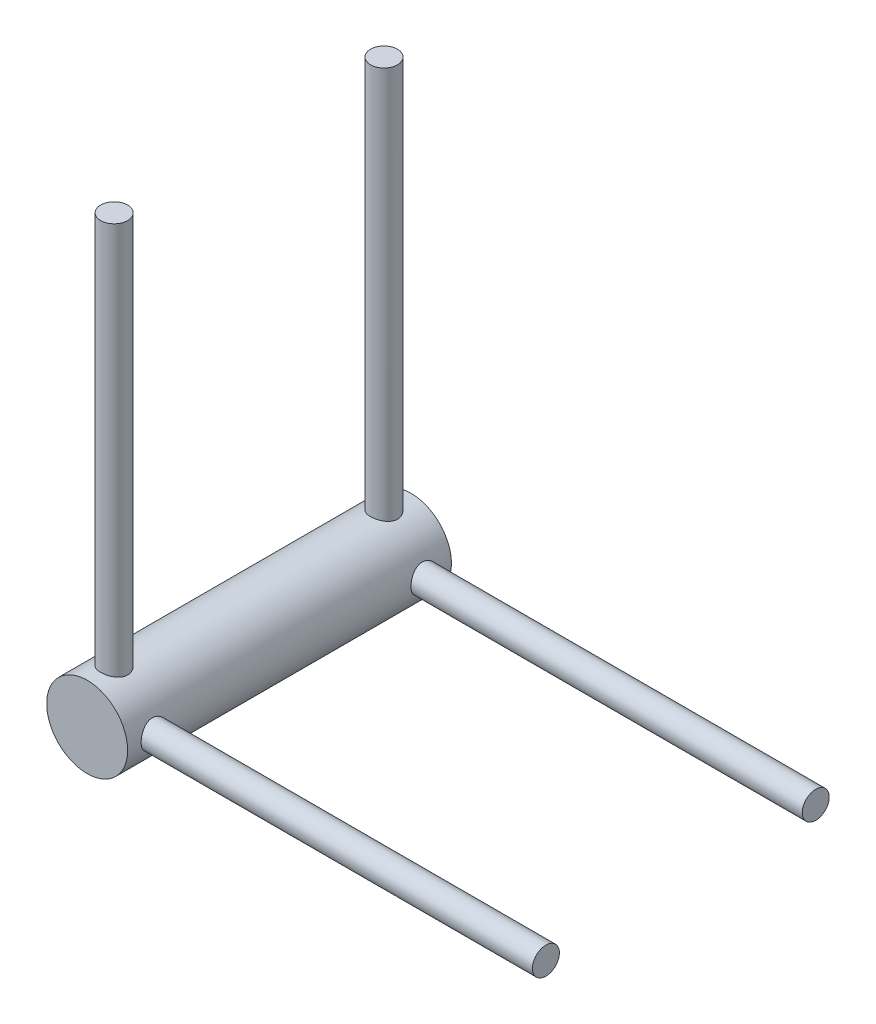
ISO-10303-21;
HEADER;
FILE_DESCRIPTION(('STEP AP214'),'2;1');
FILE_NAME('part.step','',(''),(''),'','','');
FILE_SCHEMA(('AUTOMOTIVE_DESIGN { 1 0 10303 214 1 1 1 1 }'));
ENDSEC;
DATA;
#1=APPLICATION_CONTEXT('core data for automotive mechanical design processes');
#2=APPLICATION_PROTOCOL_DEFINITION('international standard','automotive_design',2000,#1);
#3=PRODUCT_CONTEXT('',#1,'mechanical');
#4=PRODUCT('Part','Part','',(#3));
#5=PRODUCT_RELATED_PRODUCT_CATEGORY('part','',(#4));
#6=PRODUCT_DEFINITION_FORMATION('','',#4);
#7=PRODUCT_DEFINITION_CONTEXT('part definition',#1,'design');
#8=PRODUCT_DEFINITION('design','',#6,#7);
#9=PRODUCT_DEFINITION_SHAPE('','',#8);
#10=(LENGTH_UNIT() NAMED_UNIT(*) SI_UNIT(.MILLI.,.METRE.));
#11=(NAMED_UNIT(*) PLANE_ANGLE_UNIT() SI_UNIT($,.RADIAN.));
#12=(NAMED_UNIT(*) SI_UNIT($,.STERADIAN.) SOLID_ANGLE_UNIT());
#13=UNCERTAINTY_MEASURE_WITH_UNIT(LENGTH_MEASURE(1.E-05),#10,'distance_accuracy_value','');
#14=(GEOMETRIC_REPRESENTATION_CONTEXT(3) GLOBAL_UNCERTAINTY_ASSIGNED_CONTEXT((#13)) GLOBAL_UNIT_ASSIGNED_CONTEXT((#10,
#11,#12)) REPRESENTATION_CONTEXT('',''));
#15=CARTESIAN_POINT('',(0.,0.,0.));
#16=DIRECTION('',(0.,0.,1.));
#17=DIRECTION('',(1.,0.,0.));
#18=AXIS2_PLACEMENT_3D('',#15,#16,#17);
#19=CARTESIAN_POINT('',(0.,0.,38.1));
#20=DIRECTION('',(0.,0.,-1.));
#21=DIRECTION('',(-1.,0.,0.));
#22=AXIS2_PLACEMENT_3D('',#19,#20,#21);
#23=CYLINDRICAL_SURFACE('',#22,9.525);
#24=CARTESIAN_POINT('',(0.,0.,38.1));
#25=DIRECTION('',(0.,0.,1.));
#26=DIRECTION('',(1.,0.,0.));
#27=AXIS2_PLACEMENT_3D('',#24,#25,#26);
#28=CIRCLE('',#27,9.525);
#29=CARTESIAN_POINT('',(9.525,0.,38.1));
#30=VERTEX_POINT('',#29);
#31=EDGE_CURVE('E89',#30,#30,#28,.T.);
#32=ORIENTED_EDGE('',*,*,#31,.F.);
#33=EDGE_LOOP('',(#32));
#34=FACE_BOUND('',#33,.T.);
#35=CARTESIAN_POINT('',(0.,0.,-38.1));
#36=DIRECTION('',(0.,0.,1.));
#37=DIRECTION('',(1.,0.,0.));
#38=AXIS2_PLACEMENT_3D('',#35,#36,#37);
#39=CIRCLE('',#38,9.525);
#40=CARTESIAN_POINT('',(9.525,0.,-38.1));
#41=VERTEX_POINT('',#40);
#42=EDGE_CURVE('E90',#41,#41,#39,.T.);
#43=ORIENTED_EDGE('',*,*,#42,.T.);
#44=EDGE_LOOP('',(#43));
#45=FACE_BOUND('',#44,.T.);
#46=CARTESIAN_POINT('',(9.52499999999997,0.,34.925));
#47=CARTESIAN_POINT('',(9.52500048580495,-0.173238677165347,34.925000805598));
#48=CARTESIAN_POINT('',(9.52023018186454,-0.346472492659897,34.9107751550461));
#49=CARTESIAN_POINT('',(9.50167042395417,-0.687837590771688,34.8544225795053));
#50=CARTESIAN_POINT('',(9.48788003366835,-0.855968341777248,34.8122927579622));
#51=CARTESIAN_POINT('',(9.45277852602955,-1.18215660666814,34.7017364022556));
#52=CARTESIAN_POINT('',(9.43147998545459,-1.34023044718816,34.6333538266918));
#53=CARTESIAN_POINT('',(9.3835361515256,-1.64266542435691,34.4724317762382));
#54=CARTESIAN_POINT('',(9.35688980370195,-1.78702384834389,34.3798875361167));
#55=CARTESIAN_POINT('',(9.30002249856541,-2.0629298181957,34.1699030695735));
#56=CARTESIAN_POINT('',(9.26971591772517,-2.19393674844714,34.0517758312229));
#57=CARTESIAN_POINT('',(9.2094149943641,-2.43469379932912,33.7954392838067));
#58=CARTESIAN_POINT('',(9.17942072197493,-2.54443923892904,33.657225564102));
#59=CARTESIAN_POINT('',(9.12219830615344,-2.74264419157345,33.3597722592512));
#60=CARTESIAN_POINT('',(9.0950744970031,-2.83040092485178,33.2000423763505));
#61=CARTESIAN_POINT('',(9.04796594704058,-2.97757492456177,32.8670409000941));
#62=CARTESIAN_POINT('',(9.02797902810367,-3.03700083920298,32.6937734580083));
#63=CARTESIAN_POINT('',(8.99830887880273,-3.1237982402916,32.3447625217479));
#64=CARTESIAN_POINT('',(8.98830104068516,-3.15218269826287,32.1692993630472));
#65=CARTESIAN_POINT('',(8.97876209798686,-3.17925806658697,31.8158375805551));
#66=CARTESIAN_POINT('',(8.97922775597168,-3.17795815259498,31.6378397572483));
#67=CARTESIAN_POINT('',(8.99029872650972,-3.14648819425836,31.2930011983402));
#68=CARTESIAN_POINT('',(9.00043970379417,-3.11764017430521,31.1260223207321));
#69=CARTESIAN_POINT('',(9.02895888275449,-3.0340495670469,30.7994258927483));
#70=CARTESIAN_POINT('',(9.04733807064542,-2.97930387942919,30.6398092262436));
#71=CARTESIAN_POINT('',(9.09059367841715,-2.84460650934117,30.3294645200471));
#72=CARTESIAN_POINT('',(9.11556996393148,-2.76426310464556,30.1789210191343));
#73=CARTESIAN_POINT('',(9.16916373477931,-2.58092291251247,29.8930348662119));
#74=CARTESIAN_POINT('',(9.19778227084722,-2.47791958175572,29.7576966219865));
#75=CARTESIAN_POINT('',(9.25726270107577,-2.2458341312661,29.4986341758395));
#76=CARTESIAN_POINT('',(9.28816371201626,-2.11567125149229,29.3758851949337));
#77=CARTESIAN_POINT('',(9.34742029378842,-1.83622813465495,29.1537032283437));
#78=CARTESIAN_POINT('',(9.37577562033364,-1.68694606622308,29.0542724788277));
#79=CARTESIAN_POINT('',(9.42711817702495,-1.3714336714219,28.8807642467537));
#80=CARTESIAN_POINT('',(9.45004936275525,-1.20504990262187,28.8069480649932));
#81=CARTESIAN_POINT('',(9.4875530068358,-0.861279339682309,28.6886549226906));
#82=CARTESIAN_POINT('',(9.50212836854242,-0.683896391141976,28.6441677705306));
#83=CARTESIAN_POINT('',(9.52079715951823,-0.331418658755538,28.587523260379));
#84=CARTESIAN_POINT('',(9.52531755822087,-0.156557979570884,28.5740481058765));
#85=CARTESIAN_POINT('',(9.52464766056077,0.192960847123757,28.5760562386751));
#86=CARTESIAN_POINT('',(9.51945900331475,0.367619023839893,28.5915346379361));
#87=CARTESIAN_POINT('',(9.50023578476806,0.706500575516015,28.6499678070617));
#88=CARTESIAN_POINT('',(9.48646180908036,0.870879661700632,28.6921137042071));
#89=CARTESIAN_POINT('',(9.45171613685472,1.19016766849015,28.8016741861819));
#90=CARTESIAN_POINT('',(9.43074352248193,1.34507537851483,28.8690919933102));
#91=CARTESIAN_POINT('',(9.38304356837145,1.64556534104865,29.0292486210945));
#92=CARTESIAN_POINT('',(9.35617936849621,1.79079512051445,29.1226068336741));
#93=CARTESIAN_POINT('',(9.29974181184133,2.06395583568049,29.3312664262928));
#94=CARTESIAN_POINT('',(9.27016762910402,2.19188146775096,29.4465745079009));
#95=CARTESIAN_POINT('',(9.20993992337912,2.432851712285,29.7020575344459));
#96=CARTESIAN_POINT('',(9.17929841452584,2.54495607735532,29.8431242954928));
#97=CARTESIAN_POINT('',(9.121774152107,2.74401763337735,30.1427247277996));
#98=CARTESIAN_POINT('',(9.09489142987857,2.83097461468097,30.3012585446632));
#99=CARTESIAN_POINT('',(9.04819093937643,2.97687025407195,30.6313618235454));
#100=CARTESIAN_POINT('',(9.02835890517707,3.03586556962394,30.8029041013608));
#101=CARTESIAN_POINT('',(8.99829392572977,3.12386556696095,31.1543022138901));
#102=CARTESIAN_POINT('',(8.98805665630055,3.15288375947876,31.3341542651588));
#103=CARTESIAN_POINT('',(8.97883201925513,3.17905219686556,31.6871257799299));
#104=CARTESIAN_POINT('',(8.97929370817293,3.17776306695417,31.8601164304107));
#105=CARTESIAN_POINT('',(8.99005281690779,3.1471942816996,32.2032791128776));
#106=CARTESIAN_POINT('',(9.00034965132723,3.11791629228101,32.3734513120074));
#107=CARTESIAN_POINT('',(9.02920864668031,3.03330550668567,32.7029307300329));
#108=CARTESIAN_POINT('',(9.04761011221366,2.97847812359925,32.8623829193893));
#109=CARTESIAN_POINT('',(9.09054566248638,2.84473448628719,33.169947017029));
#110=CARTESIAN_POINT('',(9.11508110823773,2.76581288515833,33.3180563990219));
#111=CARTESIAN_POINT('',(9.16885482792697,2.58210269895239,33.6057356520052));
#112=CARTESIAN_POINT('',(9.19825159463785,2.47633567077754,33.7446508935274));
#113=CARTESIAN_POINT('',(9.25777156199328,2.24359115395568,34.0032651574948));
#114=CARTESIAN_POINT('',(9.28789496596782,2.11660766813345,34.1229587278096));
#115=CARTESIAN_POINT('',(9.34688346918603,1.83909194322318,34.3444335090181));
#116=CARTESIAN_POINT('',(9.3756537721899,1.68783480536163,34.4453348041094));
#117=CARTESIAN_POINT('',(9.42740021973043,1.36955960976603,34.6201696116008));
#118=CARTESIAN_POINT('',(9.45037784507677,1.2025455950702,34.6941100183025));
#119=CARTESIAN_POINT('',(9.48707510342621,0.865167329863097,34.8098161831515));
#120=CARTESIAN_POINT('',(9.5011624944151,0.695286130622597,34.8528718303862));
#121=CARTESIAN_POINT('',(9.52012342428903,0.350267320832535,34.9104593911499));
#122=CARTESIAN_POINT('',(9.52499950888796,0.17513117618077,34.9249991856015));
#123=CARTESIAN_POINT('',(9.52499999999997,0.,34.925));
#124=B_SPLINE_CURVE_WITH_KNOTS('',3,(#46,#47,#48,#49,#50,#51,#52,#53,#54,#55,#56,#57,#58,#59,
#60,#61,#62,#63,#64,#65,#66,#67,#68,#69,#70,#71,#72,#73,#74,#75,#76,#77,#78,#79,#80,#81,#82,#83,
#84,#85,#86,#87,#88,#89,#90,#91,#92,#93,#94,#95,#96,#97,#98,#99,#100,#101,#102,#103,#104,#105,
#106,#107,#108,#109,#110,#111,#112,#113,#114,#115,#116,#117,#118,#119,#120,#121,#122,#123),
.UNSPECIFIED.,.T.,.F.,(4,2,2,2,2,2,2,2,2,2,2,2,2,2,2,2,2,2,2,2,2,2,2,2,2,2,2,2,2,2,2,2,2,2,2,2,
2,2,4),(0.,0.519071561632585,1.03819701322438,1.55645698636312,2.07481924951215,
2.60936372597751,3.14402575687909,3.69406121814519,4.24392866899746,4.77526114230343,
5.30642937910267,5.81332424300315,6.32027980466156,6.8353994341754,7.35066800622309,
7.8928374595109,8.43505888444014,8.98265937939886,9.53006948685137,10.0537512658116,
10.5773446429626,11.0857715158083,11.5942632377703,12.1161301950386,12.6381567410951,
13.1839024764639,13.7296527614611,14.274292439,14.8186865394104,15.3351123975402,
15.8515075194062,16.3580948898033,16.8647947620873,17.3936046174648,17.92256420318,
18.4721392315145,19.0215736265905,19.5464607283686,20.0712027467109),.UNSPECIFIED.);
#125=CARTESIAN_POINT('',(9.52499999999997,0.,34.925));
#126=VERTEX_POINT('',#125);
#127=EDGE_CURVE('E50',#126,#126,#124,.T.);
#128=ORIENTED_EDGE('',*,*,#127,.F.);
#129=EDGE_LOOP('',(#128));
#130=FACE_BOUND('',#129,.T.);
#131=CARTESIAN_POINT('',(9.52499999999997,0.,-28.575));
#132=CARTESIAN_POINT('',(9.52500048580495,-0.173238677165335,-28.574999194402));
#133=CARTESIAN_POINT('',(9.52023018186454,-0.346472492659885,-28.5892248449539));
#134=CARTESIAN_POINT('',(9.50167042395417,-0.687837590771675,-28.6455774204947));
#135=CARTESIAN_POINT('',(9.48788003366835,-0.855968341777234,-28.6877072420378));
#136=CARTESIAN_POINT('',(9.45277852602955,-1.18215660666813,-28.7982635977444));
#137=CARTESIAN_POINT('',(9.4314799854546,-1.34023044718815,-28.8666461733082));
#138=CARTESIAN_POINT('',(9.38353615152561,-1.64266542435689,-29.0275682237618));
#139=CARTESIAN_POINT('',(9.35688980370195,-1.78702384834388,-29.1201124638833));
#140=CARTESIAN_POINT('',(9.30002249856541,-2.06292981819568,-29.3300969304265));
#141=CARTESIAN_POINT('',(9.26971591772517,-2.19393674844712,-29.4482241687771));
#142=CARTESIAN_POINT('',(9.20941499436411,-2.4346937993291,-29.7045607161933));
#143=CARTESIAN_POINT('',(9.17942072197494,-2.54443923892903,-29.842774435898));
#144=CARTESIAN_POINT('',(9.12219830615345,-2.74264419157344,-30.1402277407488));
#145=CARTESIAN_POINT('',(9.0950744970031,-2.83040092485176,-30.2999576236495));
#146=CARTESIAN_POINT('',(9.04796594704059,-2.97757492456175,-30.6329590999059));
#147=CARTESIAN_POINT('',(9.02797902810368,-3.03700083920296,-30.8062265419917));
#148=CARTESIAN_POINT('',(8.99830887880273,-3.12379824029158,-31.1552374782521));
#149=CARTESIAN_POINT('',(8.98830104068516,-3.15218269826285,-31.3307006369528));
#150=CARTESIAN_POINT('',(8.97876209798687,-3.17925806658695,-31.6841624194449));
#151=CARTESIAN_POINT('',(8.97922775597168,-3.17795815259497,-31.8621602427517));
#152=CARTESIAN_POINT('',(8.99029872650973,-3.14648819425834,-32.2069988016598));
#153=CARTESIAN_POINT('',(9.00043970379418,-3.11764017430519,-32.3739776792679));
#154=CARTESIAN_POINT('',(9.0289588827545,-3.03404956704688,-32.7005741072517));
#155=CARTESIAN_POINT('',(9.04733807064542,-2.97930387942917,-32.8601907737564));
#156=CARTESIAN_POINT('',(9.09059367841715,-2.84460650934115,-33.170535479953));
#157=CARTESIAN_POINT('',(9.11556996393148,-2.76426310464554,-33.3210789808657));
#158=CARTESIAN_POINT('',(9.16916373477932,-2.58092291251245,-33.6069651337881));
#159=CARTESIAN_POINT('',(9.19778227084722,-2.4779195817557,-33.7423033780135));
#160=CARTESIAN_POINT('',(9.25726270107578,-2.24583413126609,-34.0013658241605));
#161=CARTESIAN_POINT('',(9.28816371201627,-2.11567125149227,-34.1241148050663));
#162=CARTESIAN_POINT('',(9.34742029378842,-1.83622813465494,-34.3462967716563));
#163=CARTESIAN_POINT('',(9.37577562033364,-1.68694606622307,-34.4457275211723));
#164=CARTESIAN_POINT('',(9.42711817702495,-1.37143367142188,-34.6192357532463));
#165=CARTESIAN_POINT('',(9.45004936275525,-1.20504990262185,-34.6930519350068));
#166=CARTESIAN_POINT('',(9.48755300683581,-0.861279339682297,-34.8113450773094));
#167=CARTESIAN_POINT('',(9.50212836854242,-0.683896391141964,-34.8558322294694));
#168=CARTESIAN_POINT('',(9.52079715951823,-0.331418658755527,-34.912476739621));
#169=CARTESIAN_POINT('',(9.52531755822087,-0.156557979570873,-34.9259518941235));
#170=CARTESIAN_POINT('',(9.52464766056077,0.192960847123767,-34.9239437613249));
#171=CARTESIAN_POINT('',(9.51945900331475,0.367619023839904,-34.9084653620639));
#172=CARTESIAN_POINT('',(9.50023578476806,0.706500575516025,-34.8500321929383));
#173=CARTESIAN_POINT('',(9.48646180908036,0.870879661700641,-34.8078862957929));
#174=CARTESIAN_POINT('',(9.45171613685472,1.19016766849016,-34.6983258138181));
#175=CARTESIAN_POINT('',(9.43074352248193,1.34507537851484,-34.6309080066898));
#176=CARTESIAN_POINT('',(9.38304356837145,1.64556534104866,-34.4707513789055));
#177=CARTESIAN_POINT('',(9.35617936849621,1.79079512051445,-34.3773931663259));
#178=CARTESIAN_POINT('',(9.29974181184133,2.0639558356805,-34.1687335737072));
#179=CARTESIAN_POINT('',(9.27016762910402,2.19188146775097,-34.0534254920991));
#180=CARTESIAN_POINT('',(9.20993992337911,2.43285171228501,-33.7979424655541));
#181=CARTESIAN_POINT('',(9.17929841452583,2.54495607735534,-33.6568757045072));
#182=CARTESIAN_POINT('',(9.121774152107,2.74401763337736,-33.3572752722004));
#183=CARTESIAN_POINT('',(9.09489142987857,2.83097461468098,-33.1987414553368));
#184=CARTESIAN_POINT('',(9.04819093937642,2.97687025407196,-32.8686381764546));
#185=CARTESIAN_POINT('',(9.02835890517707,3.03586556962395,-32.6970958986392));
#186=CARTESIAN_POINT('',(8.99829392572977,3.12386556696096,-32.3456977861099));
#187=CARTESIAN_POINT('',(8.98805665630055,3.15288375947877,-32.1658457348412));
#188=CARTESIAN_POINT('',(8.97883201925512,3.17905219686557,-31.8128742200701));
#189=CARTESIAN_POINT('',(8.97929370817293,3.17776306695418,-31.6398835695893));
#190=CARTESIAN_POINT('',(8.99005281690779,3.14719428169961,-31.2967208871225));
#191=CARTESIAN_POINT('',(9.00034965132723,3.11791629228102,-31.1265486879926));
#192=CARTESIAN_POINT('',(9.02920864668031,3.03330550668568,-30.7970692699672));
#193=CARTESIAN_POINT('',(9.04761011221366,2.97847812359927,-30.6376170806107));
#194=CARTESIAN_POINT('',(9.09054566248638,2.84473448628721,-30.330052982971));
#195=CARTESIAN_POINT('',(9.11508110823773,2.76581288515834,-30.1819436009781));
#196=CARTESIAN_POINT('',(9.16885482792697,2.5821026989524,-29.8942643479948));
#197=CARTESIAN_POINT('',(9.19825159463785,2.47633567077756,-29.7553491064726));
#198=CARTESIAN_POINT('',(9.25777156199328,2.2435911539557,-29.4967348425052));
#199=CARTESIAN_POINT('',(9.28789496596782,2.11660766813346,-29.3770412721904));
#200=CARTESIAN_POINT('',(9.34688346918603,1.83909194322319,-29.1555664909819));
#201=CARTESIAN_POINT('',(9.3756537721899,1.68783480536165,-29.0546651958906));
#202=CARTESIAN_POINT('',(9.42740021973043,1.36955960976604,-28.8798303883992));
#203=CARTESIAN_POINT('',(9.45037784507677,1.20254559507022,-28.8058899816975));
#204=CARTESIAN_POINT('',(9.48707510342621,0.865167329863109,-28.6901838168485));
#205=CARTESIAN_POINT('',(9.5011624944151,0.695286130622609,-28.6471281696138));
#206=CARTESIAN_POINT('',(9.52012342428903,0.350267320832546,-28.5895406088501));
#207=CARTESIAN_POINT('',(9.52499950888796,0.175131176180782,-28.5750008143985));
#208=CARTESIAN_POINT('',(9.52499999999997,0.,-28.575));
#209=B_SPLINE_CURVE_WITH_KNOTS('',3,(#131,#132,#133,#134,#135,#136,#137,#138,#139,#140,#141,
#142,#143,#144,#145,#146,#147,#148,#149,#150,#151,#152,#153,#154,#155,#156,#157,#158,#159,#160,
#161,#162,#163,#164,#165,#166,#167,#168,#169,#170,#171,#172,#173,#174,#175,#176,#177,#178,#179,
#180,#181,#182,#183,#184,#185,#186,#187,#188,#189,#190,#191,#192,#193,#194,#195,#196,#197,#198,
#199,#200,#201,#202,#203,#204,#205,#206,#207,#208),.UNSPECIFIED.,.T.,.F.,(4,2,2,2,2,2,2,2,2,2,2,
2,2,2,2,2,2,2,2,2,2,2,2,2,2,2,2,2,2,2,2,2,2,2,2,2,2,2,4),(0.,0.519071561632585,1.03819701322438,
1.55645698636312,2.07481924951214,2.6093637259775,3.14402575687908,3.69406121814518,
4.24392866899745,4.77526114230343,5.30642937910267,5.81332424300315,6.32027980466156,
6.8353994341754,7.35066800622307,7.8928374595109,8.43505888444013,8.98265937939885,
9.53006948685136,10.0537512658116,10.5773446429626,11.0857715158083,11.5942632377703,
12.1161301950386,12.638156741095,13.1839024764639,13.7296527614611,14.2742924389999,
14.8186865394104,15.3351123975402,15.8515075194062,16.3580948898032,16.8647947620873,
17.3936046174648,17.92256420318,18.4721392315144,19.0215736265905,19.5464607283686,
20.0712027467109),.UNSPECIFIED.);
#210=CARTESIAN_POINT('',(9.52499999999997,0.,-28.575));
#211=VERTEX_POINT('',#210);
#212=EDGE_CURVE('E46',#211,#211,#209,.T.);
#213=ORIENTED_EDGE('',*,*,#212,.F.);
#214=EDGE_LOOP('',(#213));
#215=FACE_BOUND('',#214,.T.);
#216=CARTESIAN_POINT('',(0.,9.52499999999997,-34.925));
#217=CARTESIAN_POINT('',(-0.173238677165358,9.52500048580495,-34.925000805598));
#218=CARTESIAN_POINT('',(-0.346472492659909,9.52023018186454,-34.9107751550461));
#219=CARTESIAN_POINT('',(-0.687837590771699,9.50167042395417,-34.8544225795053));
#220=CARTESIAN_POINT('',(-0.855968341777258,9.48788003366834,-34.8122927579622));
#221=CARTESIAN_POINT('',(-1.18215660666815,9.45277852602955,-34.7017364022556));
#222=CARTESIAN_POINT('',(-1.34023044718817,9.43147998545459,-34.6333538266918));
#223=CARTESIAN_POINT('',(-1.64266542435692,9.3835361515256,-34.4724317762382));
#224=CARTESIAN_POINT('',(-1.7870238483439,9.35688980370195,-34.3798875361167));
#225=CARTESIAN_POINT('',(-2.06292981819571,9.30002249856541,-34.1699030695735));
#226=CARTESIAN_POINT('',(-2.19393674844715,9.26971591772516,-34.0517758312229));
#227=CARTESIAN_POINT('',(-2.43469379932913,9.2094149943641,-33.7954392838067));
#228=CARTESIAN_POINT('',(-2.54443923892906,9.17942072197493,-33.657225564102));
#229=CARTESIAN_POINT('',(-2.74264419157346,9.12219830615344,-33.3597722592512));
#230=CARTESIAN_POINT('',(-2.83040092485179,9.0950744970031,-33.2000423763505));
#231=CARTESIAN_POINT('',(-2.97757492456178,9.04796594704058,-32.8670409000941));
#232=CARTESIAN_POINT('',(-3.03700083920299,9.02797902810367,-32.6937734580083));
#233=CARTESIAN_POINT('',(-3.1237982402916,8.99830887880272,-32.3447625217479));
#234=CARTESIAN_POINT('',(-3.15218269826288,8.98830104068515,-32.1692993630472));
#235=CARTESIAN_POINT('',(-3.17925806658697,8.97876209798686,-31.8158375805551));
#236=CARTESIAN_POINT('',(-3.17795815259499,8.97922775597167,-31.6378397572483));
#237=CARTESIAN_POINT('',(-3.14648819425837,8.99029872650972,-31.2930011983402));
#238=CARTESIAN_POINT('',(-3.11764017430522,9.00043970379417,-31.1260223207321));
#239=CARTESIAN_POINT('',(-3.03404956704691,9.02895888275449,-30.7994258927483));
#240=CARTESIAN_POINT('',(-2.9793038794292,9.04733807064541,-30.6398092262437));
#241=CARTESIAN_POINT('',(-2.84460650934118,9.09059367841715,-30.3294645200471));
#242=CARTESIAN_POINT('',(-2.76426310464557,9.11556996393147,-30.1789210191343));
#243=CARTESIAN_POINT('',(-2.58092291251248,9.16916373477931,-29.8930348662119));
#244=CARTESIAN_POINT('',(-2.47791958175573,9.19778227084722,-29.7576966219865));
#245=CARTESIAN_POINT('',(-2.24583413126611,9.25726270107577,-29.4986341758395));
#246=CARTESIAN_POINT('',(-2.1156712514923,9.28816371201626,-29.3758851949337));
#247=CARTESIAN_POINT('',(-1.83622813465496,9.34742029378841,-29.1537032283437));
#248=CARTESIAN_POINT('',(-1.68694606622309,9.37577562033364,-29.0542724788277));
#249=CARTESIAN_POINT('',(-1.37143367142191,9.42711817702495,-28.8807642467537));
#250=CARTESIAN_POINT('',(-1.20504990262188,9.45004936275524,-28.8069480649932));
#251=CARTESIAN_POINT('',(-0.861279339682321,9.4875530068358,-28.6886549226906));
#252=CARTESIAN_POINT('',(-0.683896391141988,9.50212836854241,-28.6441677705306));
#253=CARTESIAN_POINT('',(-0.33141865875555,9.52079715951823,-28.587523260379));
#254=CARTESIAN_POINT('',(-0.156557979570897,9.52531755822087,-28.5740481058765));
#255=CARTESIAN_POINT('',(0.192960847123744,9.52464766056077,-28.5760562386751));
#256=CARTESIAN_POINT('',(0.36761902383988,9.51945900331475,-28.5915346379361));
#257=CARTESIAN_POINT('',(0.706500575516001,9.50023578476806,-28.6499678070617));
#258=CARTESIAN_POINT('',(0.870879661700617,9.48646180908036,-28.6921137042071));
#259=CARTESIAN_POINT('',(1.19016766849013,9.45171613685472,-28.8016741861819));
#260=CARTESIAN_POINT('',(1.34507537851481,9.43074352248193,-28.8690919933102));
#261=CARTESIAN_POINT('',(1.64556534104863,9.38304356837145,-29.0292486210945));
#262=CARTESIAN_POINT('',(1.79079512051443,9.35617936849621,-29.1226068336741));
#263=CARTESIAN_POINT('',(2.06395583568048,9.29974181184134,-29.3312664262928));
#264=CARTESIAN_POINT('',(2.19188146775094,9.27016762910403,-29.4465745079009));
#265=CARTESIAN_POINT('',(2.43285171228499,9.20993992337912,-29.7020575344459));
#266=CARTESIAN_POINT('',(2.54495607735531,9.17929841452584,-29.8431242954928));
#267=CARTESIAN_POINT('',(2.74401763337734,9.121774152107,-30.1427247277996));
#268=CARTESIAN_POINT('',(2.83097461468095,9.09489142987858,-30.3012585446632));
#269=CARTESIAN_POINT('',(2.97687025407193,9.04819093937643,-30.6313618235454));
#270=CARTESIAN_POINT('',(3.03586556962393,9.02835890517708,-30.8029041013608));
#271=CARTESIAN_POINT('',(3.12386556696094,8.99829392572978,-31.1543022138901));
#272=CARTESIAN_POINT('',(3.15288375947875,8.98805665630055,-31.3341542651588));
#273=CARTESIAN_POINT('',(3.17905219686555,8.97883201925513,-31.6871257799299));
#274=CARTESIAN_POINT('',(3.17776306695415,8.97929370817293,-31.8601164304107));
#275=CARTESIAN_POINT('',(3.14719428169959,8.99005281690779,-32.2032791128775));
#276=CARTESIAN_POINT('',(3.117916292281,9.00034965132724,-32.3734513120074));
#277=CARTESIAN_POINT('',(3.03330550668566,9.02920864668031,-32.7029307300329));
#278=CARTESIAN_POINT('',(2.97847812359924,9.04761011221367,-32.8623829193893));
#279=CARTESIAN_POINT('',(2.84473448628718,9.09054566248638,-33.169947017029));
#280=CARTESIAN_POINT('',(2.76581288515832,9.11508110823774,-33.3180563990219));
#281=CARTESIAN_POINT('',(2.58210269895238,9.16885482792697,-33.6057356520052));
#282=CARTESIAN_POINT('',(2.47633567077753,9.19825159463785,-33.7446508935274));
#283=CARTESIAN_POINT('',(2.24359115395567,9.25777156199328,-34.0032651574948));
#284=CARTESIAN_POINT('',(2.11660766813344,9.28789496596782,-34.1229587278096));
#285=CARTESIAN_POINT('',(1.83909194322318,9.34688346918603,-34.3444335090181));
#286=CARTESIAN_POINT('',(1.68783480536163,9.3756537721899,-34.4453348041094));
#287=CARTESIAN_POINT('',(1.36955960976602,9.42740021973043,-34.6201696116008));
#288=CARTESIAN_POINT('',(1.20254559507019,9.45037784507677,-34.6941100183025));
#289=CARTESIAN_POINT('',(0.865167329863086,9.48707510342621,-34.8098161831515));
#290=CARTESIAN_POINT('',(0.695286130622586,9.5011624944151,-34.8528718303862));
#291=CARTESIAN_POINT('',(0.350267320832524,9.52012342428903,-34.9104593911499));
#292=CARTESIAN_POINT('',(0.175131176180759,9.52499950888796,-34.9249991856015));
#293=CARTESIAN_POINT('',(0.,9.52499999999997,-34.925));
#294=B_SPLINE_CURVE_WITH_KNOTS('',3,(#216,#217,#218,#219,#220,#221,#222,#223,#224,#225,#226,
#227,#228,#229,#230,#231,#232,#233,#234,#235,#236,#237,#238,#239,#240,#241,#242,#243,#244,#245,
#246,#247,#248,#249,#250,#251,#252,#253,#254,#255,#256,#257,#258,#259,#260,#261,#262,#263,#264,
#265,#266,#267,#268,#269,#270,#271,#272,#273,#274,#275,#276,#277,#278,#279,#280,#281,#282,#283,
#284,#285,#286,#287,#288,#289,#290,#291,#292,#293),.UNSPECIFIED.,.T.,.F.,(4,2,2,2,2,2,2,2,2,2,2,
2,2,2,2,2,2,2,2,2,2,2,2,2,2,2,2,2,2,2,2,2,2,2,2,2,2,2,4),(0.,0.519071561632585,1.03819701322438,
1.55645698636311,2.07481924951214,2.6093637259775,3.14402575687909,3.69406121814519,
4.24392866899746,4.77526114230342,5.30642937910266,5.81332424300314,6.32027980466155,
6.83539943417539,7.35066800622308,7.8928374595109,8.43505888444013,8.98265937939885,
9.53006948685136,10.0537512658116,10.5773446429626,11.0857715158083,11.5942632377703,
12.1161301950386,12.638156741095,13.1839024764639,13.7296527614611,14.274292439,
14.8186865394104,15.3351123975402,15.8515075194062,16.3580948898032,16.8647947620873,
17.3936046174648,17.92256420318,18.4721392315144,19.0215736265905,19.5464607283686,
20.0712027467109),.UNSPECIFIED.);
#295=CARTESIAN_POINT('',(0.,9.52499999999997,-34.925));
#296=VERTEX_POINT('',#295);
#297=EDGE_CURVE('E42',#296,#296,#294,.T.);
#298=ORIENTED_EDGE('',*,*,#297,.F.);
#299=EDGE_LOOP('',(#298));
#300=FACE_BOUND('',#299,.T.);
#301=CARTESIAN_POINT('',(0.,9.52499999999997,28.575));
#302=CARTESIAN_POINT('',(-0.173238677165347,9.52500048580495,28.574999194402));
#303=CARTESIAN_POINT('',(-0.346472492659897,9.52023018186454,28.5892248449539));
#304=CARTESIAN_POINT('',(-0.687837590771689,9.50167042395417,28.6455774204947));
#305=CARTESIAN_POINT('',(-0.855968341777247,9.48788003366835,28.6877072420378));
#306=CARTESIAN_POINT('',(-1.18215660666814,9.45277852602955,28.7982635977444));
#307=CARTESIAN_POINT('',(-1.34023044718816,9.43147998545459,28.8666461733082));
#308=CARTESIAN_POINT('',(-1.64266542435691,9.3835361515256,29.0275682237618));
#309=CARTESIAN_POINT('',(-1.78702384834389,9.35688980370195,29.1201124638833));
#310=CARTESIAN_POINT('',(-2.0629298181957,9.30002249856541,29.3300969304265));
#311=CARTESIAN_POINT('',(-2.19393674844713,9.26971591772517,29.4482241687771));
#312=CARTESIAN_POINT('',(-2.43469379932912,9.2094149943641,29.7045607161933));
#313=CARTESIAN_POINT('',(-2.54443923892905,9.17942072197493,29.842774435898));
#314=CARTESIAN_POINT('',(-2.74264419157345,9.12219830615344,30.1402277407488));
#315=CARTESIAN_POINT('',(-2.83040092485178,9.0950744970031,30.2999576236495));
#316=CARTESIAN_POINT('',(-2.97757492456177,9.04796594704058,30.6329590999059));
#317=CARTESIAN_POINT('',(-3.03700083920298,9.02797902810367,30.8062265419917));
#318=CARTESIAN_POINT('',(-3.12379824029159,8.99830887880273,31.1552374782521));
#319=CARTESIAN_POINT('',(-3.15218269826287,8.98830104068516,31.3307006369528));
#320=CARTESIAN_POINT('',(-3.17925806658696,8.97876209798686,31.6841624194449));
#321=CARTESIAN_POINT('',(-3.17795815259498,8.97922775597168,31.8621602427517));
#322=CARTESIAN_POINT('',(-3.14648819425835,8.99029872650972,32.2069988016598));
#323=CARTESIAN_POINT('',(-3.11764017430521,9.00043970379417,32.3739776792679));
#324=CARTESIAN_POINT('',(-3.0340495670469,9.02895888275449,32.7005741072517));
#325=CARTESIAN_POINT('',(-2.97930387942919,9.04733807064542,32.8601907737564));
#326=CARTESIAN_POINT('',(-2.84460650934117,9.09059367841715,33.170535479953));
#327=CARTESIAN_POINT('',(-2.76426310464556,9.11556996393148,33.3210789808657));
#328=CARTESIAN_POINT('',(-2.58092291251246,9.16916373477931,33.6069651337881));
#329=CARTESIAN_POINT('',(-2.47791958175571,9.19778227084722,33.7423033780135));
#330=CARTESIAN_POINT('',(-2.2458341312661,9.25726270107577,34.0013658241605));
#331=CARTESIAN_POINT('',(-2.11567125149229,9.28816371201626,34.1241148050663));
#332=CARTESIAN_POINT('',(-1.83622813465495,9.34742029378842,34.3462967716563));
#333=CARTESIAN_POINT('',(-1.68694606622308,9.37577562033364,34.4457275211723));
#334=CARTESIAN_POINT('',(-1.3714336714219,9.42711817702495,34.6192357532463));
#335=CARTESIAN_POINT('',(-1.20504990262187,9.45004936275525,34.6930519350068));
#336=CARTESIAN_POINT('',(-0.861279339682311,9.4875530068358,34.8113450773094));
#337=CARTESIAN_POINT('',(-0.683896391141978,9.50212836854242,34.8558322294694));
#338=CARTESIAN_POINT('',(-0.331418658755542,9.52079715951823,34.912476739621));
#339=CARTESIAN_POINT('',(-0.156557979570888,9.52531755822087,34.9259518941235));
#340=CARTESIAN_POINT('',(0.192960847123753,9.52464766056077,34.9239437613249));
#341=CARTESIAN_POINT('',(0.36761902383989,9.51945900331475,34.9084653620639));
#342=CARTESIAN_POINT('',(0.706500575516013,9.50023578476806,34.8500321929383));
#343=CARTESIAN_POINT('',(0.87087966170063,9.48646180908036,34.8078862957929));
#344=CARTESIAN_POINT('',(1.19016766849015,9.45171613685472,34.6983258138181));
#345=CARTESIAN_POINT('',(1.34507537851483,9.43074352248193,34.6309080066898));
#346=CARTESIAN_POINT('',(1.64556534104864,9.38304356837145,34.4707513789055));
#347=CARTESIAN_POINT('',(1.79079512051444,9.35617936849621,34.3773931663259));
#348=CARTESIAN_POINT('',(2.06395583568048,9.29974181184133,34.1687335737072));
#349=CARTESIAN_POINT('',(2.19188146775096,9.27016762910402,34.0534254920991));
#350=CARTESIAN_POINT('',(2.432851712285,9.20993992337912,33.7979424655541));
#351=CARTESIAN_POINT('',(2.54495607735532,9.17929841452584,33.6568757045072));
#352=CARTESIAN_POINT('',(2.74401763337735,9.121774152107,33.3572752722004));
#353=CARTESIAN_POINT('',(2.83097461468097,9.09489142987857,33.1987414553368));
#354=CARTESIAN_POINT('',(2.97687025407195,9.04819093937643,32.8686381764546));
#355=CARTESIAN_POINT('',(3.03586556962394,9.02835890517708,32.6970958986392));
#356=CARTESIAN_POINT('',(3.12386556696095,8.99829392572977,32.3456977861099));
#357=CARTESIAN_POINT('',(3.15288375947876,8.98805665630055,32.1658457348412));
#358=CARTESIAN_POINT('',(3.17905219686556,8.97883201925513,31.8128742200701));
#359=CARTESIAN_POINT('',(3.17776306695417,8.97929370817293,31.6398835695893));
#360=CARTESIAN_POINT('',(3.1471942816996,8.99005281690779,31.2967208871225));
#361=CARTESIAN_POINT('',(3.11791629228101,9.00034965132723,31.1265486879926));
#362=CARTESIAN_POINT('',(3.03330550668567,9.02920864668031,30.7970692699671));
#363=CARTESIAN_POINT('',(2.97847812359926,9.04761011221366,30.6376170806107));
#364=CARTESIAN_POINT('',(2.8447344862872,9.09054566248638,30.330052982971));
#365=CARTESIAN_POINT('',(2.76581288515833,9.11508110823773,30.1819436009781));
#366=CARTESIAN_POINT('',(2.58210269895239,9.16885482792697,29.8942643479948));
#367=CARTESIAN_POINT('',(2.47633567077754,9.19825159463785,29.7553491064726));
#368=CARTESIAN_POINT('',(2.24359115395568,9.25777156199328,29.4967348425052));
#369=CARTESIAN_POINT('',(2.11660766813345,9.28789496596782,29.3770412721904));
#370=CARTESIAN_POINT('',(1.83909194322318,9.34688346918603,29.1555664909819));
#371=CARTESIAN_POINT('',(1.68783480536164,9.3756537721899,29.0546651958906));
#372=CARTESIAN_POINT('',(1.36955960976603,9.42740021973043,28.8798303883992));
#373=CARTESIAN_POINT('',(1.2025455950702,9.45037784507677,28.8058899816975));
#374=CARTESIAN_POINT('',(0.865167329863097,9.48707510342621,28.6901838168485));
#375=CARTESIAN_POINT('',(0.695286130622597,9.5011624944151,28.6471281696138));
#376=CARTESIAN_POINT('',(0.350267320832534,9.52012342428903,28.5895406088501));
#377=CARTESIAN_POINT('',(0.17513117618077,9.52499950888796,28.5750008143985));
#378=CARTESIAN_POINT('',(0.,9.52499999999997,28.575));
#379=B_SPLINE_CURVE_WITH_KNOTS('',3,(#301,#302,#303,#304,#305,#306,#307,#308,#309,#310,#311,
#312,#313,#314,#315,#316,#317,#318,#319,#320,#321,#322,#323,#324,#325,#326,#327,#328,#329,#330,
#331,#332,#333,#334,#335,#336,#337,#338,#339,#340,#341,#342,#343,#344,#345,#346,#347,#348,#349,
#350,#351,#352,#353,#354,#355,#356,#357,#358,#359,#360,#361,#362,#363,#364,#365,#366,#367,#368,
#369,#370,#371,#372,#373,#374,#375,#376,#377,#378),.UNSPECIFIED.,.T.,.F.,(4,2,2,2,2,2,2,2,2,2,2,
2,2,2,2,2,2,2,2,2,2,2,2,2,2,2,2,2,2,2,2,2,2,2,2,2,2,2,4),(0.,0.519071561632586,1.03819701322438,
1.55645698636312,2.07481924951214,2.6093637259775,3.14402575687909,3.69406121814519,
4.24392866899746,4.77526114230343,5.30642937910267,5.81332424300316,6.32027980466156,
6.8353994341754,7.35066800622308,7.8928374595109,8.43505888444014,8.98265937939885,
9.53006948685136,10.0537512658116,10.5773446429626,11.0857715158083,11.5942632377703,
12.1161301950386,12.638156741095,13.1839024764639,13.7296527614611,14.274292439,
14.8186865394104,15.3351123975402,15.8515075194062,16.3580948898033,16.8647947620873,
17.3936046174648,17.92256420318,18.4721392315144,19.0215736265905,19.5464607283686,
20.0712027467109),.UNSPECIFIED.);
#380=CARTESIAN_POINT('',(0.,9.52499999999997,28.575));
#381=VERTEX_POINT('',#380);
#382=EDGE_CURVE('E10',#381,#381,#379,.T.);
#383=ORIENTED_EDGE('',*,*,#382,.F.);
#384=EDGE_LOOP('',(#383));
#385=FACE_BOUND('',#384,.T.);
#386=ADVANCED_FACE('F32',(#34,#45,#130,#215,#300,#385),#23,.T.);
#387=CARTESIAN_POINT('',(0.,0.,38.1));
#388=DIRECTION('',(0.,0.,1.));
#389=DIRECTION('',(1.,0.,0.));
#390=AXIS2_PLACEMENT_3D('',#387,#388,#389);
#391=PLANE('',#390);
#392=ORIENTED_EDGE('',*,*,#31,.T.);
#393=EDGE_LOOP('',(#392));
#394=FACE_BOUND('',#393,.T.);
#395=ADVANCED_FACE('F84',(#394),#391,.T.);
#396=CARTESIAN_POINT('',(0.,0.,-38.1));
#397=DIRECTION('',(0.,0.,1.));
#398=DIRECTION('',(1.,0.,0.));
#399=AXIS2_PLACEMENT_3D('',#396,#397,#398);
#400=PLANE('',#399);
#401=ORIENTED_EDGE('',*,*,#42,.F.);
#402=EDGE_LOOP('',(#401));
#403=FACE_BOUND('',#402,.T.);
#404=ADVANCED_FACE('F82',(#403),#400,.F.);
#405=CARTESIAN_POINT('',(101.6,0.,31.75));
#406=DIRECTION('',(-1.,0.,0.));
#407=DIRECTION('',(0.,0.,1.));
#408=AXIS2_PLACEMENT_3D('',#405,#406,#407);
#409=CYLINDRICAL_SURFACE('',#408,3.175);
#410=CARTESIAN_POINT('',(101.6,0.,31.75));
#411=DIRECTION('',(1.,0.,0.));
#412=DIRECTION('',(0.,0.,-1.));
#413=AXIS2_PLACEMENT_3D('',#410,#411,#412);
#414=CIRCLE('',#413,3.175);
#415=CARTESIAN_POINT('',(101.6,0.,28.575));
#416=VERTEX_POINT('',#415);
#417=EDGE_CURVE('E93',#416,#416,#414,.T.);
#418=ORIENTED_EDGE('',*,*,#417,.F.);
#419=EDGE_LOOP('',(#418));
#420=FACE_BOUND('',#419,.T.);
#421=ORIENTED_EDGE('',*,*,#127,.T.);
#422=EDGE_LOOP('',(#421));
#423=FACE_BOUND('',#422,.T.);
#424=ADVANCED_FACE('F77',(#420,#423),#409,.T.);
#425=CARTESIAN_POINT('',(101.6,0.,31.75));
#426=DIRECTION('',(1.,0.,0.));
#427=DIRECTION('',(0.,0.,-1.));
#428=AXIS2_PLACEMENT_3D('',#425,#426,#427);
#429=PLANE('',#428);
#430=ORIENTED_EDGE('',*,*,#417,.T.);
#431=EDGE_LOOP('',(#430));
#432=FACE_BOUND('',#431,.T.);
#433=ADVANCED_FACE('F73',(#432),#429,.T.);
#434=CARTESIAN_POINT('',(101.6,0.,-31.75));
#435=DIRECTION('',(-1.,0.,0.));
#436=DIRECTION('',(0.,0.,1.));
#437=AXIS2_PLACEMENT_3D('',#434,#435,#436);
#438=CYLINDRICAL_SURFACE('',#437,3.175);
#439=CARTESIAN_POINT('',(101.6,0.,-31.75));
#440=DIRECTION('',(1.,0.,0.));
#441=DIRECTION('',(0.,0.,-1.));
#442=AXIS2_PLACEMENT_3D('',#439,#440,#441);
#443=CIRCLE('',#442,3.175);
#444=CARTESIAN_POINT('',(101.6,0.,-34.925));
#445=VERTEX_POINT('',#444);
#446=EDGE_CURVE('E98',#445,#445,#443,.T.);
#447=ORIENTED_EDGE('',*,*,#446,.F.);
#448=EDGE_LOOP('',(#447));
#449=FACE_BOUND('',#448,.T.);
#450=ORIENTED_EDGE('',*,*,#212,.T.);
#451=EDGE_LOOP('',(#450));
#452=FACE_BOUND('',#451,.T.);
#453=ADVANCED_FACE('F68',(#449,#452),#438,.T.);
#454=CARTESIAN_POINT('',(101.6,0.,-31.75));
#455=DIRECTION('',(1.,0.,0.));
#456=DIRECTION('',(0.,0.,-1.));
#457=AXIS2_PLACEMENT_3D('',#454,#455,#456);
#458=PLANE('',#457);
#459=ORIENTED_EDGE('',*,*,#446,.T.);
#460=EDGE_LOOP('',(#459));
#461=FACE_BOUND('',#460,.T.);
#462=ADVANCED_FACE('F65',(#461),#458,.T.);
#463=CARTESIAN_POINT('',(0.,101.6,-31.75));
#464=DIRECTION('',(0.,-1.,0.));
#465=DIRECTION('',(0.,0.,-1.));
#466=AXIS2_PLACEMENT_3D('',#463,#464,#465);
#467=CYLINDRICAL_SURFACE('',#466,3.175);
#468=CARTESIAN_POINT('',(0.,101.6,-31.75));
#469=DIRECTION('',(0.,1.,0.));
#470=DIRECTION('',(0.,0.,1.));
#471=AXIS2_PLACEMENT_3D('',#468,#469,#470);
#472=CIRCLE('',#471,3.175);
#473=CARTESIAN_POINT('',(0.,101.6,-28.575));
#474=VERTEX_POINT('',#473);
#475=EDGE_CURVE('E101',#474,#474,#472,.T.);
#476=ORIENTED_EDGE('',*,*,#475,.F.);
#477=EDGE_LOOP('',(#476));
#478=FACE_BOUND('',#477,.T.);
#479=ORIENTED_EDGE('',*,*,#297,.T.);
#480=EDGE_LOOP('',(#479));
#481=FACE_BOUND('',#480,.T.);
#482=ADVANCED_FACE('F59',(#478,#481),#467,.T.);
#483=CARTESIAN_POINT('',(0.,101.6,-31.75));
#484=DIRECTION('',(0.,1.,0.));
#485=DIRECTION('',(0.,0.,1.));
#486=AXIS2_PLACEMENT_3D('',#483,#484,#485);
#487=PLANE('',#486);
#488=ORIENTED_EDGE('',*,*,#475,.T.);
#489=EDGE_LOOP('',(#488));
#490=FACE_BOUND('',#489,.T.);
#491=ADVANCED_FACE('F64',(#490),#487,.T.);
#492=CARTESIAN_POINT('',(0.,101.6,31.75));
#493=DIRECTION('',(0.,-1.,0.));
#494=DIRECTION('',(0.,0.,-1.));
#495=AXIS2_PLACEMENT_3D('',#492,#493,#494);
#496=CYLINDRICAL_SURFACE('',#495,3.175);
#497=CARTESIAN_POINT('',(0.,101.6,31.75));
#498=DIRECTION('',(0.,1.,0.));
#499=DIRECTION('',(0.,0.,1.));
#500=AXIS2_PLACEMENT_3D('',#497,#498,#499);
#501=CIRCLE('',#500,3.175);
#502=CARTESIAN_POINT('',(0.,101.6,34.925));
#503=VERTEX_POINT('',#502);
#504=EDGE_CURVE('E104',#503,#503,#501,.T.);
#505=ORIENTED_EDGE('',*,*,#504,.F.);
#506=EDGE_LOOP('',(#505));
#507=FACE_BOUND('',#506,.T.);
#508=ORIENTED_EDGE('',*,*,#382,.T.);
#509=EDGE_LOOP('',(#508));
#510=FACE_BOUND('',#509,.T.);
#511=ADVANCED_FACE('F110',(#507,#510),#496,.T.);
#512=CARTESIAN_POINT('',(0.,101.6,31.75));
#513=DIRECTION('',(0.,1.,0.));
#514=DIRECTION('',(0.,0.,1.));
#515=AXIS2_PLACEMENT_3D('',#512,#513,#514);
#516=PLANE('',#515);
#517=ORIENTED_EDGE('',*,*,#504,.T.);
#518=EDGE_LOOP('',(#517));
#519=FACE_BOUND('',#518,.T.);
#520=ADVANCED_FACE('F108',(#519),#516,.T.);
#521=CLOSED_SHELL('',(#386,#395,#404,#424,#433,#453,#462,#482,#491,#511,#520));
#522=MANIFOLD_SOLID_BREP('B2',#521);
#523=ADVANCED_BREP_SHAPE_REPRESENTATION('',(#18,#522),#14);
#524=SHAPE_DEFINITION_REPRESENTATION(#9,#523);
ENDSEC;
END-ISO-10303-21;
